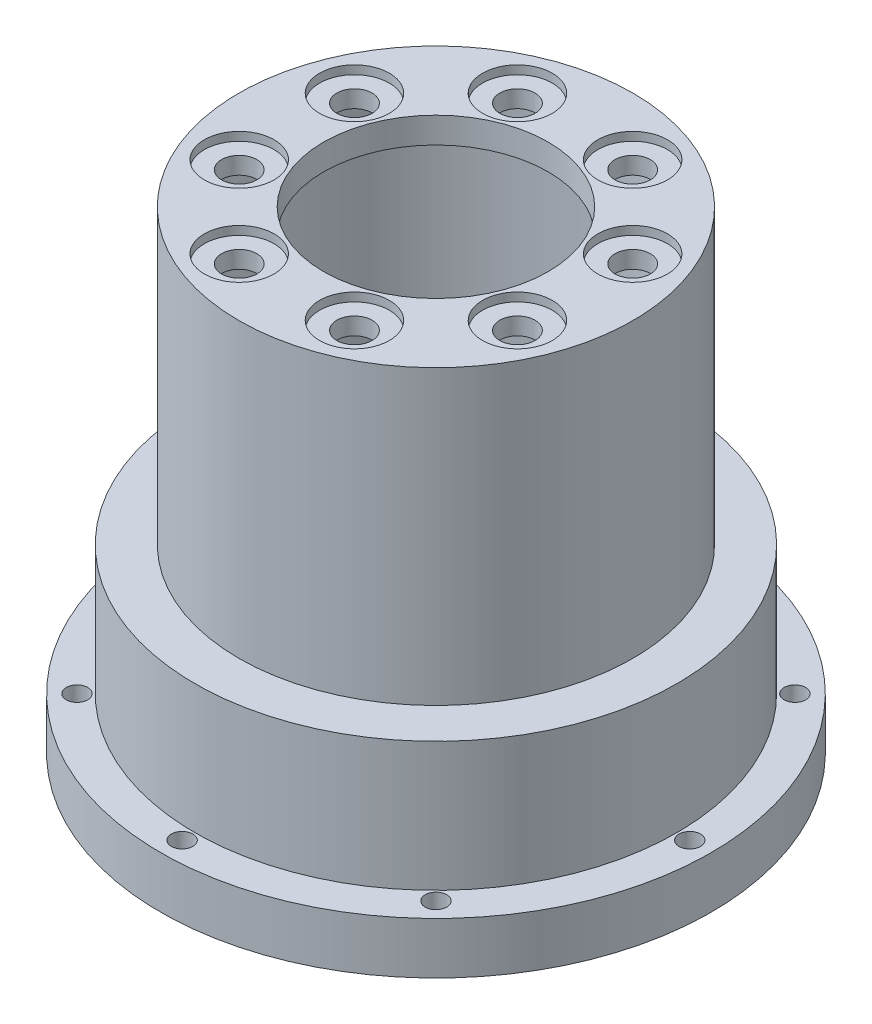
ISO-10303-21;
HEADER;
FILE_DESCRIPTION(('STEP AP214'),'2;1');
FILE_NAME('part.step','',(''),(''),'','','');
FILE_SCHEMA(('AUTOMOTIVE_DESIGN { 1 0 10303 214 1 1 1 1 }'));
ENDSEC;
DATA;
#1=APPLICATION_CONTEXT('core data for automotive mechanical design processes');
#2=APPLICATION_PROTOCOL_DEFINITION('international standard','automotive_design',2000,#1);
#3=PRODUCT_CONTEXT('',#1,'mechanical');
#4=PRODUCT('Part','Part','',(#3));
#5=PRODUCT_RELATED_PRODUCT_CATEGORY('part','',(#4));
#6=PRODUCT_DEFINITION_FORMATION('','',#4);
#7=PRODUCT_DEFINITION_CONTEXT('part definition',#1,'design');
#8=PRODUCT_DEFINITION('design','',#6,#7);
#9=PRODUCT_DEFINITION_SHAPE('','',#8);
#10=(LENGTH_UNIT() NAMED_UNIT(*) SI_UNIT(.MILLI.,.METRE.));
#11=(NAMED_UNIT(*) PLANE_ANGLE_UNIT() SI_UNIT($,.RADIAN.));
#12=(NAMED_UNIT(*) SI_UNIT($,.STERADIAN.) SOLID_ANGLE_UNIT());
#13=UNCERTAINTY_MEASURE_WITH_UNIT(LENGTH_MEASURE(1.E-05),#10,'distance_accuracy_value','');
#14=(GEOMETRIC_REPRESENTATION_CONTEXT(3) GLOBAL_UNCERTAINTY_ASSIGNED_CONTEXT((#13)) GLOBAL_UNIT_ASSIGNED_CONTEXT((#10,
#11,#12)) REPRESENTATION_CONTEXT('',''));
#15=CARTESIAN_POINT('',(0.,0.,0.));
#16=DIRECTION('',(0.,0.,1.));
#17=DIRECTION('',(1.,0.,0.));
#18=AXIS2_PLACEMENT_3D('',#15,#16,#17);
#19=CARTESIAN_POINT('',(-16.1678918189474,45.,-6.69696006638937));
#20=DIRECTION('',(0.,1.,0.));
#21=DIRECTION('',(0.,0.,1.));
#22=AXIS2_PLACEMENT_3D('',#19,#20,#21);
#23=CYLINDRICAL_SURFACE('',#22,2.05);
#24=CARTESIAN_POINT('',(-16.1678918189474,52.,-6.69696006638937));
#25=DIRECTION('',(0.,-1.,0.));
#26=DIRECTION('',(0.,0.,-1.));
#27=AXIS2_PLACEMENT_3D('',#24,#25,#26);
#28=CIRCLE('',#27,2.05);
#29=CARTESIAN_POINT('',(-16.1678918189474,52.,-8.74696006638937));
#30=VERTEX_POINT('',#29);
#31=EDGE_CURVE('E60',#30,#30,#28,.T.);
#32=ORIENTED_EDGE('',*,*,#31,.T.);
#33=EDGE_LOOP('',(#32));
#34=FACE_BOUND('',#33,.T.);
#35=CARTESIAN_POINT('',(-16.1678918189474,54.,-6.69696006638937));
#36=DIRECTION('',(0.,1.,0.));
#37=DIRECTION('',(0.,0.,1.));
#38=AXIS2_PLACEMENT_3D('',#35,#36,#37);
#39=CIRCLE('',#38,2.05);
#40=CARTESIAN_POINT('',(-16.1678918189474,54.,-4.64696006638937));
#41=VERTEX_POINT('',#40);
#42=EDGE_CURVE('E42',#41,#41,#39,.F.);
#43=ORIENTED_EDGE('',*,*,#42,.F.);
#44=EDGE_LOOP('',(#43));
#45=FACE_BOUND('',#44,.T.);
#46=ADVANCED_FACE('F38',(#34,#45),#23,.F.);
#47=CARTESIAN_POINT('',(-16.1678918189476,45.,6.6969600663888));
#48=DIRECTION('',(0.,1.,0.));
#49=DIRECTION('',(0.,0.,1.));
#50=AXIS2_PLACEMENT_3D('',#47,#48,#49);
#51=CYLINDRICAL_SURFACE('',#50,2.05);
#52=CARTESIAN_POINT('',(-16.1678918189476,52.,6.6969600663888));
#53=DIRECTION('',(0.,-1.,0.));
#54=DIRECTION('',(0.,0.,-1.));
#55=AXIS2_PLACEMENT_3D('',#52,#53,#54);
#56=CIRCLE('',#55,2.05);
#57=CARTESIAN_POINT('',(-16.1678918189476,52.,4.6469600663888));
#58=VERTEX_POINT('',#57);
#59=EDGE_CURVE('E63',#58,#58,#56,.T.);
#60=ORIENTED_EDGE('',*,*,#59,.T.);
#61=EDGE_LOOP('',(#60));
#62=FACE_BOUND('',#61,.T.);
#63=CARTESIAN_POINT('',(-16.1678918189476,54.,6.6969600663888));
#64=DIRECTION('',(0.,1.,0.));
#65=DIRECTION('',(0.,0.,1.));
#66=AXIS2_PLACEMENT_3D('',#63,#64,#65);
#67=CIRCLE('',#66,2.05);
#68=CARTESIAN_POINT('',(-16.1678918189476,54.,8.7469600663888));
#69=VERTEX_POINT('',#68);
#70=EDGE_CURVE('E99',#69,#69,#67,.F.);
#71=ORIENTED_EDGE('',*,*,#70,.F.);
#72=EDGE_LOOP('',(#71));
#73=FACE_BOUND('',#72,.T.);
#74=ADVANCED_FACE('F210',(#62,#73),#51,.F.);
#75=CARTESIAN_POINT('',(-6.69696006638931,45.,16.1678918189474));
#76=DIRECTION('',(0.,1.,0.));
#77=DIRECTION('',(0.,0.,1.));
#78=AXIS2_PLACEMENT_3D('',#75,#76,#77);
#79=CYLINDRICAL_SURFACE('',#78,2.05);
#80=CARTESIAN_POINT('',(-6.69696006638931,52.,16.1678918189474));
#81=DIRECTION('',(0.,-1.,0.));
#82=DIRECTION('',(0.,0.,-1.));
#83=AXIS2_PLACEMENT_3D('',#80,#81,#82);
#84=CIRCLE('',#83,2.05);
#85=CARTESIAN_POINT('',(-6.69696006638931,52.,14.1178918189474));
#86=VERTEX_POINT('',#85);
#87=EDGE_CURVE('E67',#86,#86,#84,.T.);
#88=ORIENTED_EDGE('',*,*,#87,.T.);
#89=EDGE_LOOP('',(#88));
#90=FACE_BOUND('',#89,.T.);
#91=CARTESIAN_POINT('',(-6.69696006638931,54.,16.1678918189474));
#92=DIRECTION('',(0.,1.,0.));
#93=DIRECTION('',(0.,0.,1.));
#94=AXIS2_PLACEMENT_3D('',#91,#92,#93);
#95=CIRCLE('',#94,2.05);
#96=CARTESIAN_POINT('',(-6.69696006638931,54.,18.2178918189474));
#97=VERTEX_POINT('',#96);
#98=EDGE_CURVE('E97',#97,#97,#95,.F.);
#99=ORIENTED_EDGE('',*,*,#98,.F.);
#100=EDGE_LOOP('',(#99));
#101=FACE_BOUND('',#100,.T.);
#102=ADVANCED_FACE('F216',(#90,#101),#79,.F.);
#103=CARTESIAN_POINT('',(6.69696006638897,45.,16.1678918189476));
#104=DIRECTION('',(0.,1.,0.));
#105=DIRECTION('',(0.,0.,1.));
#106=AXIS2_PLACEMENT_3D('',#103,#104,#105);
#107=CYLINDRICAL_SURFACE('',#106,2.05);
#108=CARTESIAN_POINT('',(6.69696006638897,52.,16.1678918189476));
#109=DIRECTION('',(0.,-1.,0.));
#110=DIRECTION('',(0.,0.,-1.));
#111=AXIS2_PLACEMENT_3D('',#108,#109,#110);
#112=CIRCLE('',#111,2.05);
#113=CARTESIAN_POINT('',(6.69696006638897,52.,14.1178918189476));
#114=VERTEX_POINT('',#113);
#115=EDGE_CURVE('E70',#114,#114,#112,.T.);
#116=ORIENTED_EDGE('',*,*,#115,.T.);
#117=EDGE_LOOP('',(#116));
#118=FACE_BOUND('',#117,.T.);
#119=CARTESIAN_POINT('',(6.69696006638897,54.,16.1678918189476));
#120=DIRECTION('',(0.,1.,0.));
#121=DIRECTION('',(0.,0.,1.));
#122=AXIS2_PLACEMENT_3D('',#119,#120,#121);
#123=CIRCLE('',#122,2.05);
#124=CARTESIAN_POINT('',(6.69696006638897,54.,18.2178918189476));
#125=VERTEX_POINT('',#124);
#126=EDGE_CURVE('E94',#125,#125,#123,.F.);
#127=ORIENTED_EDGE('',*,*,#126,.F.);
#128=EDGE_LOOP('',(#127));
#129=FACE_BOUND('',#128,.T.);
#130=ADVANCED_FACE('F531',(#118,#129),#107,.F.);
#131=CARTESIAN_POINT('',(16.1678918189474,45.,6.69696006638926));
#132=DIRECTION('',(0.,1.,0.));
#133=DIRECTION('',(0.,0.,1.));
#134=AXIS2_PLACEMENT_3D('',#131,#132,#133);
#135=CYLINDRICAL_SURFACE('',#134,2.05);
#136=CARTESIAN_POINT('',(16.1678918189474,52.,6.69696006638926));
#137=DIRECTION('',(0.,-1.,0.));
#138=DIRECTION('',(0.,0.,-1.));
#139=AXIS2_PLACEMENT_3D('',#136,#137,#138);
#140=CIRCLE('',#139,2.05);
#141=CARTESIAN_POINT('',(16.1678918189474,52.,4.64696006638926));
#142=VERTEX_POINT('',#141);
#143=EDGE_CURVE('E73',#142,#142,#140,.T.);
#144=ORIENTED_EDGE('',*,*,#143,.T.);
#145=EDGE_LOOP('',(#144));
#146=FACE_BOUND('',#145,.T.);
#147=CARTESIAN_POINT('',(16.1678918189474,54.,6.69696006638926));
#148=DIRECTION('',(0.,1.,0.));
#149=DIRECTION('',(0.,0.,1.));
#150=AXIS2_PLACEMENT_3D('',#147,#148,#149);
#151=CIRCLE('',#150,2.05);
#152=CARTESIAN_POINT('',(16.1678918189474,54.,8.74696006638926));
#153=VERTEX_POINT('',#152);
#154=EDGE_CURVE('E91',#153,#153,#151,.F.);
#155=ORIENTED_EDGE('',*,*,#154,.F.);
#156=EDGE_LOOP('',(#155));
#157=FACE_BOUND('',#156,.T.);
#158=ADVANCED_FACE('F539',(#146,#157),#135,.F.);
#159=CARTESIAN_POINT('',(16.1678918189476,45.,-6.69696006638892));
#160=DIRECTION('',(0.,1.,0.));
#161=DIRECTION('',(0.,0.,1.));
#162=AXIS2_PLACEMENT_3D('',#159,#160,#161);
#163=CYLINDRICAL_SURFACE('',#162,2.05);
#164=CARTESIAN_POINT('',(16.1678918189476,52.,-6.69696006638892));
#165=DIRECTION('',(0.,-1.,0.));
#166=DIRECTION('',(0.,0.,-1.));
#167=AXIS2_PLACEMENT_3D('',#164,#165,#166);
#168=CIRCLE('',#167,2.05);
#169=CARTESIAN_POINT('',(16.1678918189476,52.,-8.74696006638892));
#170=VERTEX_POINT('',#169);
#171=EDGE_CURVE('E76',#170,#170,#168,.T.);
#172=ORIENTED_EDGE('',*,*,#171,.T.);
#173=EDGE_LOOP('',(#172));
#174=FACE_BOUND('',#173,.T.);
#175=CARTESIAN_POINT('',(16.1678918189476,54.,-6.69696006638892));
#176=DIRECTION('',(0.,1.,0.));
#177=DIRECTION('',(0.,0.,1.));
#178=AXIS2_PLACEMENT_3D('',#175,#176,#177);
#179=CIRCLE('',#178,2.05);
#180=CARTESIAN_POINT('',(16.1678918189476,54.,-4.64696006638892));
#181=VERTEX_POINT('',#180);
#182=EDGE_CURVE('E87',#181,#181,#179,.F.);
#183=ORIENTED_EDGE('',*,*,#182,.F.);
#184=EDGE_LOOP('',(#183));
#185=FACE_BOUND('',#184,.T.);
#186=ADVANCED_FACE('F548',(#174,#185),#163,.F.);
#187=CARTESIAN_POINT('',(6.6969600663892,45.,-16.1678918189475));
#188=DIRECTION('',(0.,1.,0.));
#189=DIRECTION('',(0.,0.,1.));
#190=AXIS2_PLACEMENT_3D('',#187,#188,#189);
#191=CYLINDRICAL_SURFACE('',#190,2.05);
#192=CARTESIAN_POINT('',(6.6969600663892,52.,-16.1678918189475));
#193=DIRECTION('',(0.,-1.,0.));
#194=DIRECTION('',(0.,0.,-1.));
#195=AXIS2_PLACEMENT_3D('',#192,#193,#194);
#196=CIRCLE('',#195,2.05);
#197=CARTESIAN_POINT('',(6.6969600663892,52.,-18.2178918189475));
#198=VERTEX_POINT('',#197);
#199=EDGE_CURVE('E59',#198,#198,#196,.T.);
#200=ORIENTED_EDGE('',*,*,#199,.T.);
#201=EDGE_LOOP('',(#200));
#202=FACE_BOUND('',#201,.T.);
#203=CARTESIAN_POINT('',(6.6969600663892,54.,-16.1678918189475));
#204=DIRECTION('',(0.,1.,0.));
#205=DIRECTION('',(0.,0.,1.));
#206=AXIS2_PLACEMENT_3D('',#203,#204,#205);
#207=CIRCLE('',#206,2.05);
#208=CARTESIAN_POINT('',(6.6969600663892,54.,-14.1178918189475));
#209=VERTEX_POINT('',#208);
#210=EDGE_CURVE('E84',#209,#209,#207,.F.);
#211=ORIENTED_EDGE('',*,*,#210,.F.);
#212=EDGE_LOOP('',(#211));
#213=FACE_BOUND('',#212,.T.);
#214=ADVANCED_FACE('F225',(#202,#213),#191,.F.);
#215=CARTESIAN_POINT('',(-6.69696006638897,45.,-16.1678918189476));
#216=DIRECTION('',(0.,1.,0.));
#217=DIRECTION('',(0.,0.,1.));
#218=AXIS2_PLACEMENT_3D('',#215,#216,#217);
#219=CYLINDRICAL_SURFACE('',#218,2.05);
#220=CARTESIAN_POINT('',(-6.69696006638897,52.,-16.1678918189476));
#221=DIRECTION('',(0.,-1.,0.));
#222=DIRECTION('',(0.,0.,-1.));
#223=AXIS2_PLACEMENT_3D('',#220,#221,#222);
#224=CIRCLE('',#223,2.05);
#225=CARTESIAN_POINT('',(-6.69696006638897,52.,-18.2178918189476));
#226=VERTEX_POINT('',#225);
#227=EDGE_CURVE('E55',#226,#226,#224,.T.);
#228=ORIENTED_EDGE('',*,*,#227,.T.);
#229=EDGE_LOOP('',(#228));
#230=FACE_BOUND('',#229,.T.);
#231=CARTESIAN_POINT('',(-6.69696006638897,54.,-16.1678918189476));
#232=DIRECTION('',(0.,1.,0.));
#233=DIRECTION('',(0.,0.,1.));
#234=AXIS2_PLACEMENT_3D('',#231,#232,#233);
#235=CIRCLE('',#234,2.05);
#236=CARTESIAN_POINT('',(-6.69696006638897,54.,-14.1178918189476));
#237=VERTEX_POINT('',#236);
#238=EDGE_CURVE('E64',#237,#237,#235,.F.);
#239=ORIENTED_EDGE('',*,*,#238,.F.);
#240=EDGE_LOOP('',(#239));
#241=FACE_BOUND('',#240,.T.);
#242=ADVANCED_FACE('F222',(#230,#241),#219,.F.);
#243=CARTESIAN_POINT('',(26.,0.,0.));
#244=DIRECTION('',(0.,-1.,0.));
#245=DIRECTION('',(0.,0.,-1.));
#246=AXIS2_PLACEMENT_3D('',#243,#244,#245);
#247=PLANE('',#246);
#248=CARTESIAN_POINT('',(20.8596500450032,0.,-20.8596500450031));
#249=DIRECTION('',(0.,-1.,0.));
#250=DIRECTION('',(0.,0.,-1.));
#251=AXIS2_PLACEMENT_3D('',#248,#249,#250);
#252=CIRCLE('',#251,1.24999999999999);
#253=CARTESIAN_POINT('',(20.8596500450032,0.,-22.1096500450031));
#254=VERTEX_POINT('',#253);
#255=EDGE_CURVE('E58',#254,#254,#252,.T.);
#256=ORIENTED_EDGE('',*,*,#255,.F.);
#257=EDGE_LOOP('',(#256));
#258=FACE_BOUND('',#257,.T.);
#259=CARTESIAN_POINT('',(-20.8596500450031,0.,-20.8596500450032));
#260=DIRECTION('',(0.,-1.,0.));
#261=DIRECTION('',(0.,0.,-1.));
#262=AXIS2_PLACEMENT_3D('',#259,#260,#261);
#263=CIRCLE('',#262,1.24999999999999);
#264=CARTESIAN_POINT('',(-20.8596500450031,0.,-22.1096500450032));
#265=VERTEX_POINT('',#264);
#266=EDGE_CURVE('E120',#265,#265,#263,.T.);
#267=ORIENTED_EDGE('',*,*,#266,.F.);
#268=EDGE_LOOP('',(#267));
#269=FACE_BOUND('',#268,.T.);
#270=CARTESIAN_POINT('',(-20.8596500450032,0.,20.8596500450031));
#271=DIRECTION('',(0.,-1.,0.));
#272=DIRECTION('',(0.,0.,-1.));
#273=AXIS2_PLACEMENT_3D('',#270,#271,#272);
#274=CIRCLE('',#273,1.24999999999999);
#275=CARTESIAN_POINT('',(-20.8596500450032,0.,19.6096500450031));
#276=VERTEX_POINT('',#275);
#277=EDGE_CURVE('E126',#276,#276,#274,.T.);
#278=ORIENTED_EDGE('',*,*,#277,.F.);
#279=EDGE_LOOP('',(#278));
#280=FACE_BOUND('',#279,.T.);
#281=CARTESIAN_POINT('',(20.8596500450031,0.,20.8596500450032));
#282=DIRECTION('',(0.,-1.,0.));
#283=DIRECTION('',(0.,0.,-1.));
#284=AXIS2_PLACEMENT_3D('',#281,#282,#283);
#285=CIRCLE('',#284,1.24999999999999);
#286=CARTESIAN_POINT('',(20.8596500450031,0.,19.6096500450032));
#287=VERTEX_POINT('',#286);
#288=EDGE_CURVE('E132',#287,#287,#285,.T.);
#289=ORIENTED_EDGE('',*,*,#288,.F.);
#290=EDGE_LOOP('',(#289));
#291=FACE_BOUND('',#290,.T.);
#292=CARTESIAN_POINT('',(0.,0.,-29.5));
#293=DIRECTION('',(0.,-1.,0.));
#294=DIRECTION('',(0.,0.,-1.));
#295=AXIS2_PLACEMENT_3D('',#292,#293,#294);
#296=CIRCLE('',#295,1.24999999999999);
#297=CARTESIAN_POINT('',(0.,0.,-30.75));
#298=VERTEX_POINT('',#297);
#299=EDGE_CURVE('E138',#298,#298,#296,.T.);
#300=ORIENTED_EDGE('',*,*,#299,.F.);
#301=EDGE_LOOP('',(#300));
#302=FACE_BOUND('',#301,.T.);
#303=CARTESIAN_POINT('',(-29.5,0.,0.));
#304=DIRECTION('',(0.,-1.,0.));
#305=DIRECTION('',(0.,0.,-1.));
#306=AXIS2_PLACEMENT_3D('',#303,#304,#305);
#307=CIRCLE('',#306,1.24999999999999);
#308=CARTESIAN_POINT('',(-29.5,0.,-1.24999999999999));
#309=VERTEX_POINT('',#308);
#310=EDGE_CURVE('E144',#309,#309,#307,.T.);
#311=ORIENTED_EDGE('',*,*,#310,.F.);
#312=EDGE_LOOP('',(#311));
#313=FACE_BOUND('',#312,.T.);
#314=CARTESIAN_POINT('',(0.,0.,29.5));
#315=DIRECTION('',(0.,-1.,0.));
#316=DIRECTION('',(0.,0.,-1.));
#317=AXIS2_PLACEMENT_3D('',#314,#315,#316);
#318=CIRCLE('',#317,1.24999999999999);
#319=CARTESIAN_POINT('',(0.,0.,28.25));
#320=VERTEX_POINT('',#319);
#321=EDGE_CURVE('E150',#320,#320,#318,.T.);
#322=ORIENTED_EDGE('',*,*,#321,.F.);
#323=EDGE_LOOP('',(#322));
#324=FACE_BOUND('',#323,.T.);
#325=CARTESIAN_POINT('',(29.5,0.,0.));
#326=DIRECTION('',(0.,-1.,0.));
#327=DIRECTION('',(0.,0.,-1.));
#328=AXIS2_PLACEMENT_3D('',#325,#326,#327);
#329=CIRCLE('',#328,1.24999999999999);
#330=CARTESIAN_POINT('',(29.5,0.,-1.24999999999999));
#331=VERTEX_POINT('',#330);
#332=EDGE_CURVE('E156',#331,#331,#329,.T.);
#333=ORIENTED_EDGE('',*,*,#332,.F.);
#334=EDGE_LOOP('',(#333));
#335=FACE_BOUND('',#334,.T.);
#336=CARTESIAN_POINT('',(0.,0.,0.));
#337=DIRECTION('',(0.,-1.,0.));
#338=DIRECTION('',(0.,0.,-1.));
#339=AXIS2_PLACEMENT_3D('',#336,#337,#338);
#340=CIRCLE('',#339,32.);
#341=CARTESIAN_POINT('',(0.,0.,-32.));
#342=VERTEX_POINT('',#341);
#343=EDGE_CURVE('E10',#342,#342,#340,.T.);
#344=ORIENTED_EDGE('',*,*,#343,.T.);
#345=EDGE_LOOP('',(#344));
#346=FACE_BOUND('',#345,.T.);
#347=CARTESIAN_POINT('',(0.,0.,0.));
#348=DIRECTION('',(0.,-1.,0.));
#349=DIRECTION('',(0.,0.,-1.));
#350=AXIS2_PLACEMENT_3D('',#347,#348,#349);
#351=CIRCLE('',#350,26.);
#352=CARTESIAN_POINT('',(0.,0.,-26.));
#353=VERTEX_POINT('',#352);
#354=EDGE_CURVE('E162',#353,#353,#351,.T.);
#355=ORIENTED_EDGE('',*,*,#354,.F.);
#356=EDGE_LOOP('',(#355));
#357=FACE_BOUND('',#356,.T.);
#358=ADVANCED_FACE('F40',(#258,#269,#280,#291,#302,#313,#324,#335,#346,#357),#247,.T.);
#359=CARTESIAN_POINT('',(0.,0.,0.));
#360=DIRECTION('',(0.,-1.,0.));
#361=DIRECTION('',(0.,0.,-1.));
#362=AXIS2_PLACEMENT_3D('',#359,#360,#361);
#363=CYLINDRICAL_SURFACE('',#362,32.);
#364=CARTESIAN_POINT('',(0.,6.,0.));
#365=DIRECTION('',(0.,-1.,0.));
#366=DIRECTION('',(0.,0.,-1.));
#367=AXIS2_PLACEMENT_3D('',#364,#365,#366);
#368=CIRCLE('',#367,32.);
#369=CARTESIAN_POINT('',(0.,6.,-32.));
#370=VERTEX_POINT('',#369);
#371=EDGE_CURVE('E46',#370,#370,#368,.T.);
#372=ORIENTED_EDGE('',*,*,#371,.T.);
#373=EDGE_LOOP('',(#372));
#374=FACE_BOUND('',#373,.T.);
#375=ORIENTED_EDGE('',*,*,#343,.F.);
#376=EDGE_LOOP('',(#375));
#377=FACE_BOUND('',#376,.T.);
#378=ADVANCED_FACE('F206',(#374,#377),#363,.T.);
#379=CARTESIAN_POINT('',(32.,6.,0.));
#380=DIRECTION('',(0.,1.,0.));
#381=DIRECTION('',(0.,0.,1.));
#382=AXIS2_PLACEMENT_3D('',#379,#380,#381);
#383=PLANE('',#382);
#384=CARTESIAN_POINT('',(20.8596500450032,6.,-20.8596500450031));
#385=DIRECTION('',(0.,1.,0.));
#386=DIRECTION('',(0.,0.,1.));
#387=AXIS2_PLACEMENT_3D('',#384,#385,#386);
#388=CIRCLE('',#387,1.24999999999999);
#389=CARTESIAN_POINT('',(20.8596500450032,6.,-19.6096500450031));
#390=VERTEX_POINT('',#389);
#391=EDGE_CURVE('E117',#390,#390,#388,.T.);
#392=ORIENTED_EDGE('',*,*,#391,.F.);
#393=EDGE_LOOP('',(#392));
#394=FACE_BOUND('',#393,.T.);
#395=CARTESIAN_POINT('',(-20.8596500450031,6.,-20.8596500450032));
#396=DIRECTION('',(0.,1.,0.));
#397=DIRECTION('',(0.,0.,1.));
#398=AXIS2_PLACEMENT_3D('',#395,#396,#397);
#399=CIRCLE('',#398,1.24999999999999);
#400=CARTESIAN_POINT('',(-20.8596500450031,6.,-19.6096500450032));
#401=VERTEX_POINT('',#400);
#402=EDGE_CURVE('E123',#401,#401,#399,.T.);
#403=ORIENTED_EDGE('',*,*,#402,.F.);
#404=EDGE_LOOP('',(#403));
#405=FACE_BOUND('',#404,.T.);
#406=CARTESIAN_POINT('',(-20.8596500450032,6.,20.8596500450031));
#407=DIRECTION('',(0.,1.,0.));
#408=DIRECTION('',(0.,0.,1.));
#409=AXIS2_PLACEMENT_3D('',#406,#407,#408);
#410=CIRCLE('',#409,1.24999999999999);
#411=CARTESIAN_POINT('',(-20.8596500450032,6.,22.1096500450031));
#412=VERTEX_POINT('',#411);
#413=EDGE_CURVE('E129',#412,#412,#410,.T.);
#414=ORIENTED_EDGE('',*,*,#413,.F.);
#415=EDGE_LOOP('',(#414));
#416=FACE_BOUND('',#415,.T.);
#417=CARTESIAN_POINT('',(20.8596500450031,6.,20.8596500450032));
#418=DIRECTION('',(0.,1.,0.));
#419=DIRECTION('',(0.,0.,1.));
#420=AXIS2_PLACEMENT_3D('',#417,#418,#419);
#421=CIRCLE('',#420,1.24999999999999);
#422=CARTESIAN_POINT('',(20.8596500450031,6.,22.1096500450032));
#423=VERTEX_POINT('',#422);
#424=EDGE_CURVE('E135',#423,#423,#421,.T.);
#425=ORIENTED_EDGE('',*,*,#424,.F.);
#426=EDGE_LOOP('',(#425));
#427=FACE_BOUND('',#426,.T.);
#428=CARTESIAN_POINT('',(0.,6.,-29.5));
#429=DIRECTION('',(0.,1.,0.));
#430=DIRECTION('',(0.,0.,1.));
#431=AXIS2_PLACEMENT_3D('',#428,#429,#430);
#432=CIRCLE('',#431,1.24999999999999);
#433=CARTESIAN_POINT('',(0.,6.,-28.25));
#434=VERTEX_POINT('',#433);
#435=EDGE_CURVE('E141',#434,#434,#432,.T.);
#436=ORIENTED_EDGE('',*,*,#435,.F.);
#437=EDGE_LOOP('',(#436));
#438=FACE_BOUND('',#437,.T.);
#439=CARTESIAN_POINT('',(-29.5,6.,0.));
#440=DIRECTION('',(0.,1.,0.));
#441=DIRECTION('',(0.,0.,1.));
#442=AXIS2_PLACEMENT_3D('',#439,#440,#441);
#443=CIRCLE('',#442,1.24999999999999);
#444=CARTESIAN_POINT('',(-29.5,6.,1.24999999999999));
#445=VERTEX_POINT('',#444);
#446=EDGE_CURVE('E147',#445,#445,#443,.T.);
#447=ORIENTED_EDGE('',*,*,#446,.F.);
#448=EDGE_LOOP('',(#447));
#449=FACE_BOUND('',#448,.T.);
#450=CARTESIAN_POINT('',(0.,6.,29.5));
#451=DIRECTION('',(0.,1.,0.));
#452=DIRECTION('',(0.,0.,1.));
#453=AXIS2_PLACEMENT_3D('',#450,#451,#452);
#454=CIRCLE('',#453,1.24999999999999);
#455=CARTESIAN_POINT('',(0.,6.,30.75));
#456=VERTEX_POINT('',#455);
#457=EDGE_CURVE('E153',#456,#456,#454,.T.);
#458=ORIENTED_EDGE('',*,*,#457,.F.);
#459=EDGE_LOOP('',(#458));
#460=FACE_BOUND('',#459,.T.);
#461=CARTESIAN_POINT('',(29.5,6.,0.));
#462=DIRECTION('',(0.,1.,0.));
#463=DIRECTION('',(0.,0.,1.));
#464=AXIS2_PLACEMENT_3D('',#461,#462,#463);
#465=CIRCLE('',#464,1.24999999999999);
#466=CARTESIAN_POINT('',(29.5,6.,1.24999999999999));
#467=VERTEX_POINT('',#466);
#468=EDGE_CURVE('E159',#467,#467,#465,.T.);
#469=ORIENTED_EDGE('',*,*,#468,.F.);
#470=EDGE_LOOP('',(#469));
#471=FACE_BOUND('',#470,.T.);
#472=CARTESIAN_POINT('',(0.,6.,0.));
#473=DIRECTION('',(0.,-1.,0.));
#474=DIRECTION('',(0.,0.,-1.));
#475=AXIS2_PLACEMENT_3D('',#472,#473,#474);
#476=CIRCLE('',#475,28.);
#477=CARTESIAN_POINT('',(0.,6.,-28.));
#478=VERTEX_POINT('',#477);
#479=EDGE_CURVE('E51',#478,#478,#476,.T.);
#480=ORIENTED_EDGE('',*,*,#479,.T.);
#481=EDGE_LOOP('',(#480));
#482=FACE_BOUND('',#481,.T.);
#483=ORIENTED_EDGE('',*,*,#371,.F.);
#484=EDGE_LOOP('',(#483));
#485=FACE_BOUND('',#484,.T.);
#486=ADVANCED_FACE('F191',(#394,#405,#416,#427,#438,#449,#460,#471,#482,#485),#383,.T.);
#487=CARTESIAN_POINT('',(0.,0.,0.));
#488=DIRECTION('',(0.,-1.,0.));
#489=DIRECTION('',(0.,0.,-1.));
#490=AXIS2_PLACEMENT_3D('',#487,#488,#489);
#491=CYLINDRICAL_SURFACE('',#490,28.);
#492=CARTESIAN_POINT('',(0.,21.,0.));
#493=DIRECTION('',(0.,-1.,0.));
#494=DIRECTION('',(0.,0.,-1.));
#495=AXIS2_PLACEMENT_3D('',#492,#493,#494);
#496=CIRCLE('',#495,28.);
#497=CARTESIAN_POINT('',(0.,21.,-28.));
#498=VERTEX_POINT('',#497);
#499=EDGE_CURVE('E186',#498,#498,#496,.T.);
#500=ORIENTED_EDGE('',*,*,#499,.T.);
#501=EDGE_LOOP('',(#500));
#502=FACE_BOUND('',#501,.T.);
#503=ORIENTED_EDGE('',*,*,#479,.F.);
#504=EDGE_LOOP('',(#503));
#505=FACE_BOUND('',#504,.T.);
#506=ADVANCED_FACE('F194',(#502,#505),#491,.T.);
#507=CARTESIAN_POINT('',(28.,21.,0.));
#508=DIRECTION('',(0.,1.,0.));
#509=DIRECTION('',(0.,0.,1.));
#510=AXIS2_PLACEMENT_3D('',#507,#508,#509);
#511=PLANE('',#510);
#512=CARTESIAN_POINT('',(0.,21.,0.));
#513=DIRECTION('',(0.,-1.,0.));
#514=DIRECTION('',(0.,0.,-1.));
#515=AXIS2_PLACEMENT_3D('',#512,#513,#514);
#516=CIRCLE('',#515,22.9);
#517=CARTESIAN_POINT('',(0.,21.,-22.9));
#518=VERTEX_POINT('',#517);
#519=EDGE_CURVE('E183',#518,#518,#516,.T.);
#520=ORIENTED_EDGE('',*,*,#519,.T.);
#521=EDGE_LOOP('',(#520));
#522=FACE_BOUND('',#521,.T.);
#523=ORIENTED_EDGE('',*,*,#499,.F.);
#524=EDGE_LOOP('',(#523));
#525=FACE_BOUND('',#524,.T.);
#526=ADVANCED_FACE('F196',(#522,#525),#511,.T.);
#527=CARTESIAN_POINT('',(0.,0.,0.));
#528=DIRECTION('',(0.,-1.,0.));
#529=DIRECTION('',(0.,0.,-1.));
#530=AXIS2_PLACEMENT_3D('',#527,#528,#529);
#531=CYLINDRICAL_SURFACE('',#530,22.9);
#532=CARTESIAN_POINT('',(0.,55.,0.));
#533=DIRECTION('',(0.,-1.,0.));
#534=DIRECTION('',(0.,0.,-1.));
#535=AXIS2_PLACEMENT_3D('',#532,#533,#534);
#536=CIRCLE('',#535,22.9);
#537=CARTESIAN_POINT('',(0.,55.,-22.9));
#538=VERTEX_POINT('',#537);
#539=EDGE_CURVE('E180',#538,#538,#536,.T.);
#540=ORIENTED_EDGE('',*,*,#539,.T.);
#541=EDGE_LOOP('',(#540));
#542=FACE_BOUND('',#541,.T.);
#543=ORIENTED_EDGE('',*,*,#519,.F.);
#544=EDGE_LOOP('',(#543));
#545=FACE_BOUND('',#544,.T.);
#546=ADVANCED_FACE('F203',(#542,#545),#531,.T.);
#547=CARTESIAN_POINT('',(22.9,55.,0.));
#548=DIRECTION('',(0.,1.,0.));
#549=DIRECTION('',(0.,0.,1.));
#550=AXIS2_PLACEMENT_3D('',#547,#548,#549);
#551=PLANE('',#550);
#552=CARTESIAN_POINT('',(6.6969600663892,55.,-16.1678918189475));
#553=DIRECTION('',(0.,1.,0.));
#554=DIRECTION('',(-0.707106781186549,0.,0.707106781186546));
#555=AXIS2_PLACEMENT_3D('',#552,#553,#554);
#556=CIRCLE('',#555,4.05);
#557=CARTESIAN_POINT('',(3.83317760258368,55.,-13.304109355142));
#558=VERTEX_POINT('',#557);
#559=EDGE_CURVE('E828',#558,#558,#556,.T.);
#560=ORIENTED_EDGE('',*,*,#559,.F.);
#561=EDGE_LOOP('',(#560));
#562=FACE_BOUND('',#561,.T.);
#563=CARTESIAN_POINT('',(16.1678918189476,55.,-6.69696006638892));
#564=DIRECTION('',(0.,1.,0.));
#565=DIRECTION('',(-1.,0.,0.));
#566=AXIS2_PLACEMENT_3D('',#563,#564,#565);
#567=CIRCLE('',#566,4.05);
#568=CARTESIAN_POINT('',(12.1178918189476,55.,-6.69696006638893));
#569=VERTEX_POINT('',#568);
#570=EDGE_CURVE('E822',#569,#569,#567,.T.);
#571=ORIENTED_EDGE('',*,*,#570,.F.);
#572=EDGE_LOOP('',(#571));
#573=FACE_BOUND('',#572,.T.);
#574=CARTESIAN_POINT('',(16.1678918189474,55.,6.69696006638926));
#575=DIRECTION('',(0.,1.,0.));
#576=DIRECTION('',(-0.707106781186544,0.,-0.707106781186551));
#577=AXIS2_PLACEMENT_3D('',#574,#575,#576);
#578=CIRCLE('',#577,4.05);
#579=CARTESIAN_POINT('',(13.3041093551419,55.,3.83317760258372));
#580=VERTEX_POINT('',#579);
#581=EDGE_CURVE('E816',#580,#580,#578,.T.);
#582=ORIENTED_EDGE('',*,*,#581,.F.);
#583=EDGE_LOOP('',(#582));
#584=FACE_BOUND('',#583,.T.);
#585=CARTESIAN_POINT('',(6.69696006638897,55.,16.1678918189476));
#586=DIRECTION('',(0.,1.,0.));
#587=DIRECTION('',(0.,0.,-1.));
#588=AXIS2_PLACEMENT_3D('',#585,#586,#587);
#589=CIRCLE('',#588,4.05);
#590=CARTESIAN_POINT('',(6.69696006638897,55.,12.1178918189476));
#591=VERTEX_POINT('',#590);
#592=EDGE_CURVE('E810',#591,#591,#589,.T.);
#593=ORIENTED_EDGE('',*,*,#592,.F.);
#594=EDGE_LOOP('',(#593));
#595=FACE_BOUND('',#594,.T.);
#596=CARTESIAN_POINT('',(-6.69696006638931,55.,16.1678918189474));
#597=DIRECTION('',(0.,1.,0.));
#598=DIRECTION('',(0.707106781186554,0.,-0.707106781186541));
#599=AXIS2_PLACEMENT_3D('',#596,#597,#598);
#600=CIRCLE('',#599,4.05);
#601=CARTESIAN_POINT('',(-3.83317760258377,55.,13.3041093551419));
#602=VERTEX_POINT('',#601);
#603=EDGE_CURVE('E804',#602,#602,#600,.T.);
#604=ORIENTED_EDGE('',*,*,#603,.F.);
#605=EDGE_LOOP('',(#604));
#606=FACE_BOUND('',#605,.T.);
#607=CARTESIAN_POINT('',(-16.1678918189476,55.,6.6969600663888));
#608=DIRECTION('',(0.,1.,0.));
#609=DIRECTION('',(1.,0.,0.));
#610=AXIS2_PLACEMENT_3D('',#607,#608,#609);
#611=CIRCLE('',#610,4.05);
#612=CARTESIAN_POINT('',(-12.1178918189476,55.,6.69696006638885));
#613=VERTEX_POINT('',#612);
#614=EDGE_CURVE('E796',#613,#613,#611,.T.);
#615=ORIENTED_EDGE('',*,*,#614,.F.);
#616=EDGE_LOOP('',(#615));
#617=FACE_BOUND('',#616,.T.);
#618=CARTESIAN_POINT('',(-16.1678918189474,55.,-6.69696006638937));
#619=DIRECTION('',(0.,1.,0.));
#620=DIRECTION('',(0.707106781186539,0.,0.707106781186556));
#621=AXIS2_PLACEMENT_3D('',#618,#619,#620);
#622=CIRCLE('',#621,4.05);
#623=CARTESIAN_POINT('',(-13.3041093551419,55.,-3.83317760258382));
#624=VERTEX_POINT('',#623);
#625=EDGE_CURVE('E794',#624,#624,#622,.T.);
#626=ORIENTED_EDGE('',*,*,#625,.F.);
#627=EDGE_LOOP('',(#626));
#628=FACE_BOUND('',#627,.T.);
#629=CARTESIAN_POINT('',(-6.69696006638897,55.,-16.1678918189476));
#630=DIRECTION('',(0.,1.,0.));
#631=DIRECTION('',(0.,0.,1.));
#632=AXIS2_PLACEMENT_3D('',#629,#630,#631);
#633=CIRCLE('',#632,4.05);
#634=CARTESIAN_POINT('',(-6.69696006638897,55.,-12.1178918189476));
#635=VERTEX_POINT('',#634);
#636=EDGE_CURVE('E104',#635,#635,#633,.T.);
#637=ORIENTED_EDGE('',*,*,#636,.F.);
#638=EDGE_LOOP('',(#637));
#639=FACE_BOUND('',#638,.T.);
#640=CARTESIAN_POINT('',(0.,55.,0.));
#641=DIRECTION('',(0.,-1.,0.));
#642=DIRECTION('',(0.,0.,-1.));
#643=AXIS2_PLACEMENT_3D('',#640,#641,#642);
#644=CIRCLE('',#643,13.05);
#645=CARTESIAN_POINT('',(0.,55.,-13.05));
#646=VERTEX_POINT('',#645);
#647=EDGE_CURVE('E177',#646,#646,#644,.T.);
#648=ORIENTED_EDGE('',*,*,#647,.T.);
#649=EDGE_LOOP('',(#648));
#650=FACE_BOUND('',#649,.T.);
#651=ORIENTED_EDGE('',*,*,#539,.F.);
#652=EDGE_LOOP('',(#651));
#653=FACE_BOUND('',#652,.T.);
#654=ADVANCED_FACE('F279',(#562,#573,#584,#595,#606,#617,#628,#639,#650,#653),#551,.T.);
#655=CARTESIAN_POINT('',(0.,0.,0.));
#656=DIRECTION('',(0.,-1.,0.));
#657=DIRECTION('',(0.,0.,-1.));
#658=AXIS2_PLACEMENT_3D('',#655,#656,#657);
#659=CYLINDRICAL_SURFACE('',#658,13.05);
#660=CARTESIAN_POINT('',(0.,52.,0.));
#661=DIRECTION('',(0.,-1.,0.));
#662=DIRECTION('',(0.,0.,-1.));
#663=AXIS2_PLACEMENT_3D('',#660,#661,#662);
#664=CIRCLE('',#663,13.05);
#665=CARTESIAN_POINT('',(0.,52.,-13.05));
#666=VERTEX_POINT('',#665);
#667=EDGE_CURVE('E174',#666,#666,#664,.T.);
#668=ORIENTED_EDGE('',*,*,#667,.T.);
#669=EDGE_LOOP('',(#668));
#670=FACE_BOUND('',#669,.T.);
#671=ORIENTED_EDGE('',*,*,#647,.F.);
#672=EDGE_LOOP('',(#671));
#673=FACE_BOUND('',#672,.T.);
#674=ADVANCED_FACE('F275',(#670,#673),#659,.F.);
#675=CARTESIAN_POINT('',(13.05,52.,0.));
#676=DIRECTION('',(0.,-1.,0.));
#677=DIRECTION('',(0.,0.,-1.));
#678=AXIS2_PLACEMENT_3D('',#675,#676,#677);
#679=PLANE('',#678);
#680=ORIENTED_EDGE('',*,*,#199,.F.);
#681=EDGE_LOOP('',(#680));
#682=FACE_BOUND('',#681,.T.);
#683=ORIENTED_EDGE('',*,*,#171,.F.);
#684=EDGE_LOOP('',(#683));
#685=FACE_BOUND('',#684,.T.);
#686=ORIENTED_EDGE('',*,*,#143,.F.);
#687=EDGE_LOOP('',(#686));
#688=FACE_BOUND('',#687,.T.);
#689=ORIENTED_EDGE('',*,*,#115,.F.);
#690=EDGE_LOOP('',(#689));
#691=FACE_BOUND('',#690,.T.);
#692=ORIENTED_EDGE('',*,*,#87,.F.);
#693=EDGE_LOOP('',(#692));
#694=FACE_BOUND('',#693,.T.);
#695=ORIENTED_EDGE('',*,*,#59,.F.);
#696=EDGE_LOOP('',(#695));
#697=FACE_BOUND('',#696,.T.);
#698=ORIENTED_EDGE('',*,*,#31,.F.);
#699=EDGE_LOOP('',(#698));
#700=FACE_BOUND('',#699,.T.);
#701=ORIENTED_EDGE('',*,*,#227,.F.);
#702=EDGE_LOOP('',(#701));
#703=FACE_BOUND('',#702,.T.);
#704=CARTESIAN_POINT('',(0.,52.,0.));
#705=DIRECTION('',(0.,-1.,0.));
#706=DIRECTION('',(0.,0.,-1.));
#707=AXIS2_PLACEMENT_3D('',#704,#705,#706);
#708=CIRCLE('',#707,21.1);
#709=CARTESIAN_POINT('',(0.,52.,-21.1));
#710=VERTEX_POINT('',#709);
#711=EDGE_CURVE('E171',#710,#710,#708,.T.);
#712=ORIENTED_EDGE('',*,*,#711,.T.);
#713=EDGE_LOOP('',(#712));
#714=FACE_BOUND('',#713,.T.);
#715=ORIENTED_EDGE('',*,*,#667,.F.);
#716=EDGE_LOOP('',(#715));
#717=FACE_BOUND('',#716,.T.);
#718=ADVANCED_FACE('F271',(#682,#685,#688,#691,#694,#697,#700,#703,#714,#717),#679,.T.);
#719=CARTESIAN_POINT('',(0.,0.,0.));
#720=DIRECTION('',(0.,-1.,0.));
#721=DIRECTION('',(0.,0.,-1.));
#722=AXIS2_PLACEMENT_3D('',#719,#720,#721);
#723=CYLINDRICAL_SURFACE('',#722,21.1);
#724=CARTESIAN_POINT('',(0.,18.,0.));
#725=DIRECTION('',(0.,-1.,0.));
#726=DIRECTION('',(0.,0.,-1.));
#727=AXIS2_PLACEMENT_3D('',#724,#725,#726);
#728=CIRCLE('',#727,21.1);
#729=CARTESIAN_POINT('',(0.,18.,-21.1));
#730=VERTEX_POINT('',#729);
#731=EDGE_CURVE('E168',#730,#730,#728,.T.);
#732=ORIENTED_EDGE('',*,*,#731,.T.);
#733=EDGE_LOOP('',(#732));
#734=FACE_BOUND('',#733,.T.);
#735=ORIENTED_EDGE('',*,*,#711,.F.);
#736=EDGE_LOOP('',(#735));
#737=FACE_BOUND('',#736,.T.);
#738=ADVANCED_FACE('F267',(#734,#737),#723,.F.);
#739=CARTESIAN_POINT('',(21.1,18.,0.));
#740=DIRECTION('',(0.,-1.,0.));
#741=DIRECTION('',(0.,0.,-1.));
#742=AXIS2_PLACEMENT_3D('',#739,#740,#741);
#743=PLANE('',#742);
#744=CARTESIAN_POINT('',(0.,18.,0.));
#745=DIRECTION('',(0.,-1.,0.));
#746=DIRECTION('',(0.,0.,-1.));
#747=AXIS2_PLACEMENT_3D('',#744,#745,#746);
#748=CIRCLE('',#747,26.);
#749=CARTESIAN_POINT('',(0.,18.,-26.));
#750=VERTEX_POINT('',#749);
#751=EDGE_CURVE('E165',#750,#750,#748,.T.);
#752=ORIENTED_EDGE('',*,*,#751,.T.);
#753=EDGE_LOOP('',(#752));
#754=FACE_BOUND('',#753,.T.);
#755=ORIENTED_EDGE('',*,*,#731,.F.);
#756=EDGE_LOOP('',(#755));
#757=FACE_BOUND('',#756,.T.);
#758=ADVANCED_FACE('F263',(#754,#757),#743,.T.);
#759=CARTESIAN_POINT('',(0.,0.,0.));
#760=DIRECTION('',(0.,-1.,0.));
#761=DIRECTION('',(0.,0.,-1.));
#762=AXIS2_PLACEMENT_3D('',#759,#760,#761);
#763=CYLINDRICAL_SURFACE('',#762,26.);
#764=ORIENTED_EDGE('',*,*,#354,.T.);
#765=EDGE_LOOP('',(#764));
#766=FACE_BOUND('',#765,.T.);
#767=ORIENTED_EDGE('',*,*,#751,.F.);
#768=EDGE_LOOP('',(#767));
#769=FACE_BOUND('',#768,.T.);
#770=ADVANCED_FACE('F259',(#766,#769),#763,.F.);
#771=CARTESIAN_POINT('',(29.5,0.,0.));
#772=DIRECTION('',(0.,-1.,0.));
#773=DIRECTION('',(0.,0.,-1.));
#774=AXIS2_PLACEMENT_3D('',#771,#772,#773);
#775=CYLINDRICAL_SURFACE('',#774,1.24999999999999);
#776=ORIENTED_EDGE('',*,*,#332,.T.);
#777=EDGE_LOOP('',(#776));
#778=FACE_BOUND('',#777,.T.);
#779=ORIENTED_EDGE('',*,*,#468,.T.);
#780=EDGE_LOOP('',(#779));
#781=FACE_BOUND('',#780,.T.);
#782=ADVANCED_FACE('F255',(#778,#781),#775,.F.);
#783=CARTESIAN_POINT('',(0.,0.,29.5));
#784=DIRECTION('',(0.,-1.,0.));
#785=DIRECTION('',(0.,0.,-1.));
#786=AXIS2_PLACEMENT_3D('',#783,#784,#785);
#787=CYLINDRICAL_SURFACE('',#786,1.24999999999999);
#788=ORIENTED_EDGE('',*,*,#321,.T.);
#789=EDGE_LOOP('',(#788));
#790=FACE_BOUND('',#789,.T.);
#791=ORIENTED_EDGE('',*,*,#457,.T.);
#792=EDGE_LOOP('',(#791));
#793=FACE_BOUND('',#792,.T.);
#794=ADVANCED_FACE('F251',(#790,#793),#787,.F.);
#795=CARTESIAN_POINT('',(-29.5,0.,0.));
#796=DIRECTION('',(0.,-1.,0.));
#797=DIRECTION('',(0.,0.,-1.));
#798=AXIS2_PLACEMENT_3D('',#795,#796,#797);
#799=CYLINDRICAL_SURFACE('',#798,1.24999999999999);
#800=ORIENTED_EDGE('',*,*,#310,.T.);
#801=EDGE_LOOP('',(#800));
#802=FACE_BOUND('',#801,.T.);
#803=ORIENTED_EDGE('',*,*,#446,.T.);
#804=EDGE_LOOP('',(#803));
#805=FACE_BOUND('',#804,.T.);
#806=ADVANCED_FACE('F247',(#802,#805),#799,.F.);
#807=CARTESIAN_POINT('',(0.,0.,-29.5));
#808=DIRECTION('',(0.,-1.,0.));
#809=DIRECTION('',(0.,0.,-1.));
#810=AXIS2_PLACEMENT_3D('',#807,#808,#809);
#811=CYLINDRICAL_SURFACE('',#810,1.24999999999999);
#812=ORIENTED_EDGE('',*,*,#299,.T.);
#813=EDGE_LOOP('',(#812));
#814=FACE_BOUND('',#813,.T.);
#815=ORIENTED_EDGE('',*,*,#435,.T.);
#816=EDGE_LOOP('',(#815));
#817=FACE_BOUND('',#816,.T.);
#818=ADVANCED_FACE('F243',(#814,#817),#811,.F.);
#819=CARTESIAN_POINT('',(20.8596500450031,0.,20.8596500450032));
#820=DIRECTION('',(0.,-1.,0.));
#821=DIRECTION('',(0.,0.,-1.));
#822=AXIS2_PLACEMENT_3D('',#819,#820,#821);
#823=CYLINDRICAL_SURFACE('',#822,1.24999999999999);
#824=ORIENTED_EDGE('',*,*,#288,.T.);
#825=EDGE_LOOP('',(#824));
#826=FACE_BOUND('',#825,.T.);
#827=ORIENTED_EDGE('',*,*,#424,.T.);
#828=EDGE_LOOP('',(#827));
#829=FACE_BOUND('',#828,.T.);
#830=ADVANCED_FACE('F239',(#826,#829),#823,.F.);
#831=CARTESIAN_POINT('',(-20.8596500450032,0.,20.8596500450031));
#832=DIRECTION('',(0.,-1.,0.));
#833=DIRECTION('',(0.,0.,-1.));
#834=AXIS2_PLACEMENT_3D('',#831,#832,#833);
#835=CYLINDRICAL_SURFACE('',#834,1.24999999999999);
#836=ORIENTED_EDGE('',*,*,#277,.T.);
#837=EDGE_LOOP('',(#836));
#838=FACE_BOUND('',#837,.T.);
#839=ORIENTED_EDGE('',*,*,#413,.T.);
#840=EDGE_LOOP('',(#839));
#841=FACE_BOUND('',#840,.T.);
#842=ADVANCED_FACE('F235',(#838,#841),#835,.F.);
#843=CARTESIAN_POINT('',(-20.8596500450031,0.,-20.8596500450032));
#844=DIRECTION('',(0.,-1.,0.));
#845=DIRECTION('',(0.,0.,-1.));
#846=AXIS2_PLACEMENT_3D('',#843,#844,#845);
#847=CYLINDRICAL_SURFACE('',#846,1.24999999999999);
#848=ORIENTED_EDGE('',*,*,#266,.T.);
#849=EDGE_LOOP('',(#848));
#850=FACE_BOUND('',#849,.T.);
#851=ORIENTED_EDGE('',*,*,#402,.T.);
#852=EDGE_LOOP('',(#851));
#853=FACE_BOUND('',#852,.T.);
#854=ADVANCED_FACE('F231',(#850,#853),#847,.F.);
#855=CARTESIAN_POINT('',(20.8596500450032,0.,-20.8596500450031));
#856=DIRECTION('',(0.,-1.,0.));
#857=DIRECTION('',(0.,0.,-1.));
#858=AXIS2_PLACEMENT_3D('',#855,#856,#857);
#859=CYLINDRICAL_SURFACE('',#858,1.24999999999999);
#860=ORIENTED_EDGE('',*,*,#255,.T.);
#861=EDGE_LOOP('',(#860));
#862=FACE_BOUND('',#861,.T.);
#863=ORIENTED_EDGE('',*,*,#391,.T.);
#864=EDGE_LOOP('',(#863));
#865=FACE_BOUND('',#864,.T.);
#866=ADVANCED_FACE('F227',(#862,#865),#859,.F.);
#867=CARTESIAN_POINT('',(-6.69696006638897,54.,-16.1678918189476));
#868=DIRECTION('',(0.,1.,0.));
#869=DIRECTION('',(0.,0.,1.));
#870=AXIS2_PLACEMENT_3D('',#867,#868,#869);
#871=PLANE('',#870);
#872=CARTESIAN_POINT('',(-6.69696006638897,54.,-16.1678918189476));
#873=DIRECTION('',(0.,1.,0.));
#874=DIRECTION('',(0.,0.,1.));
#875=AXIS2_PLACEMENT_3D('',#872,#873,#874);
#876=CIRCLE('',#875,4.05);
#877=CARTESIAN_POINT('',(-6.69696006638897,54.,-12.1178918189476));
#878=VERTEX_POINT('',#877);
#879=EDGE_CURVE('E83',#878,#878,#876,.T.);
#880=ORIENTED_EDGE('',*,*,#879,.T.);
#881=EDGE_LOOP('',(#880));
#882=FACE_BOUND('',#881,.T.);
#883=ORIENTED_EDGE('',*,*,#238,.T.);
#884=EDGE_LOOP('',(#883));
#885=FACE_BOUND('',#884,.T.);
#886=ADVANCED_FACE('F230',(#882,#885),#871,.T.);
#887=CARTESIAN_POINT('',(-6.69696006638897,54.,-16.1678918189476));
#888=DIRECTION('',(0.,1.,0.));
#889=DIRECTION('',(0.,0.,1.));
#890=AXIS2_PLACEMENT_3D('',#887,#888,#889);
#891=CYLINDRICAL_SURFACE('',#890,4.05);
#892=ORIENTED_EDGE('',*,*,#879,.F.);
#893=EDGE_LOOP('',(#892));
#894=FACE_BOUND('',#893,.T.);
#895=ORIENTED_EDGE('',*,*,#636,.T.);
#896=EDGE_LOOP('',(#895));
#897=FACE_BOUND('',#896,.T.);
#898=ADVANCED_FACE('F366',(#894,#897),#891,.F.);
#899=CARTESIAN_POINT('',(6.6969600663892,54.,-16.1678918189475));
#900=DIRECTION('',(0.,1.,0.));
#901=DIRECTION('',(-0.707106781186549,0.,0.707106781186546));
#902=AXIS2_PLACEMENT_3D('',#899,#900,#901);
#903=PLANE('',#902);
#904=CARTESIAN_POINT('',(6.6969600663892,54.,-16.1678918189475));
#905=DIRECTION('',(0.,1.,0.));
#906=DIRECTION('',(-0.707106781186549,0.,0.707106781186546));
#907=AXIS2_PLACEMENT_3D('',#904,#905,#906);
#908=CIRCLE('',#907,4.05);
#909=CARTESIAN_POINT('',(3.83317760258368,54.,-13.304109355142));
#910=VERTEX_POINT('',#909);
#911=EDGE_CURVE('E88',#910,#910,#908,.T.);
#912=ORIENTED_EDGE('',*,*,#911,.T.);
#913=EDGE_LOOP('',(#912));
#914=FACE_BOUND('',#913,.T.);
#915=ORIENTED_EDGE('',*,*,#210,.T.);
#916=EDGE_LOOP('',(#915));
#917=FACE_BOUND('',#916,.T.);
#918=ADVANCED_FACE('F374',(#914,#917),#903,.T.);
#919=CARTESIAN_POINT('',(6.6969600663892,54.,-16.1678918189475));
#920=DIRECTION('',(0.,1.,0.));
#921=DIRECTION('',(0.,0.,1.));
#922=AXIS2_PLACEMENT_3D('',#919,#920,#921);
#923=CYLINDRICAL_SURFACE('',#922,4.05);
#924=ORIENTED_EDGE('',*,*,#911,.F.);
#925=EDGE_LOOP('',(#924));
#926=FACE_BOUND('',#925,.T.);
#927=ORIENTED_EDGE('',*,*,#559,.T.);
#928=EDGE_LOOP('',(#927));
#929=FACE_BOUND('',#928,.T.);
#930=ADVANCED_FACE('F381',(#926,#929),#923,.F.);
#931=CARTESIAN_POINT('',(16.1678918189476,54.,-6.69696006638892));
#932=DIRECTION('',(0.,1.,0.));
#933=DIRECTION('',(-1.,0.,0.));
#934=AXIS2_PLACEMENT_3D('',#931,#932,#933);
#935=PLANE('',#934);
#936=CARTESIAN_POINT('',(16.1678918189476,54.,-6.69696006638892));
#937=DIRECTION('',(0.,1.,0.));
#938=DIRECTION('',(-1.,0.,0.));
#939=AXIS2_PLACEMENT_3D('',#936,#937,#938);
#940=CIRCLE('',#939,4.05);
#941=CARTESIAN_POINT('',(12.1178918189476,54.,-6.69696006638893));
#942=VERTEX_POINT('',#941);
#943=EDGE_CURVE('E825',#942,#942,#940,.T.);
#944=ORIENTED_EDGE('',*,*,#943,.T.);
#945=EDGE_LOOP('',(#944));
#946=FACE_BOUND('',#945,.T.);
#947=ORIENTED_EDGE('',*,*,#182,.T.);
#948=EDGE_LOOP('',(#947));
#949=FACE_BOUND('',#948,.T.);
#950=ADVANCED_FACE('F389',(#946,#949),#935,.T.);
#951=CARTESIAN_POINT('',(16.1678918189476,54.,-6.69696006638892));
#952=DIRECTION('',(0.,1.,0.));
#953=DIRECTION('',(0.,0.,1.));
#954=AXIS2_PLACEMENT_3D('',#951,#952,#953);
#955=CYLINDRICAL_SURFACE('',#954,4.05);
#956=ORIENTED_EDGE('',*,*,#943,.F.);
#957=EDGE_LOOP('',(#956));
#958=FACE_BOUND('',#957,.T.);
#959=ORIENTED_EDGE('',*,*,#570,.T.);
#960=EDGE_LOOP('',(#959));
#961=FACE_BOUND('',#960,.T.);
#962=ADVANCED_FACE('F397',(#958,#961),#955,.F.);
#963=CARTESIAN_POINT('',(16.1678918189474,54.,6.69696006638926));
#964=DIRECTION('',(0.,1.,0.));
#965=DIRECTION('',(-0.707106781186544,0.,-0.707106781186551));
#966=AXIS2_PLACEMENT_3D('',#963,#964,#965);
#967=PLANE('',#966);
#968=CARTESIAN_POINT('',(16.1678918189474,54.,6.69696006638926));
#969=DIRECTION('',(0.,1.,0.));
#970=DIRECTION('',(-0.707106781186544,0.,-0.707106781186551));
#971=AXIS2_PLACEMENT_3D('',#968,#969,#970);
#972=CIRCLE('',#971,4.05);
#973=CARTESIAN_POINT('',(13.3041093551419,54.,3.83317760258372));
#974=VERTEX_POINT('',#973);
#975=EDGE_CURVE('E819',#974,#974,#972,.T.);
#976=ORIENTED_EDGE('',*,*,#975,.T.);
#977=EDGE_LOOP('',(#976));
#978=FACE_BOUND('',#977,.T.);
#979=ORIENTED_EDGE('',*,*,#154,.T.);
#980=EDGE_LOOP('',(#979));
#981=FACE_BOUND('',#980,.T.);
#982=ADVANCED_FACE('F405',(#978,#981),#967,.T.);
#983=CARTESIAN_POINT('',(16.1678918189474,54.,6.69696006638926));
#984=DIRECTION('',(0.,1.,0.));
#985=DIRECTION('',(0.,0.,1.));
#986=AXIS2_PLACEMENT_3D('',#983,#984,#985);
#987=CYLINDRICAL_SURFACE('',#986,4.05);
#988=ORIENTED_EDGE('',*,*,#975,.F.);
#989=EDGE_LOOP('',(#988));
#990=FACE_BOUND('',#989,.T.);
#991=ORIENTED_EDGE('',*,*,#581,.T.);
#992=EDGE_LOOP('',(#991));
#993=FACE_BOUND('',#992,.T.);
#994=ADVANCED_FACE('F413',(#990,#993),#987,.F.);
#995=CARTESIAN_POINT('',(6.69696006638897,54.,16.1678918189476));
#996=DIRECTION('',(0.,1.,0.));
#997=DIRECTION('',(0.,0.,-1.));
#998=AXIS2_PLACEMENT_3D('',#995,#996,#997);
#999=PLANE('',#998);
#1000=CARTESIAN_POINT('',(6.69696006638897,54.,16.1678918189476));
#1001=DIRECTION('',(0.,1.,0.));
#1002=DIRECTION('',(0.,0.,-1.));
#1003=AXIS2_PLACEMENT_3D('',#1000,#1001,#1002);
#1004=CIRCLE('',#1003,4.05);
#1005=CARTESIAN_POINT('',(6.69696006638897,54.,12.1178918189476));
#1006=VERTEX_POINT('',#1005);
#1007=EDGE_CURVE('E813',#1006,#1006,#1004,.T.);
#1008=ORIENTED_EDGE('',*,*,#1007,.T.);
#1009=EDGE_LOOP('',(#1008));
#1010=FACE_BOUND('',#1009,.T.);
#1011=ORIENTED_EDGE('',*,*,#126,.T.);
#1012=EDGE_LOOP('',(#1011));
#1013=FACE_BOUND('',#1012,.T.);
#1014=ADVANCED_FACE('F421',(#1010,#1013),#999,.T.);
#1015=CARTESIAN_POINT('',(6.69696006638897,54.,16.1678918189476));
#1016=DIRECTION('',(0.,1.,0.));
#1017=DIRECTION('',(0.,0.,1.));
#1018=AXIS2_PLACEMENT_3D('',#1015,#1016,#1017);
#1019=CYLINDRICAL_SURFACE('',#1018,4.05);
#1020=ORIENTED_EDGE('',*,*,#1007,.F.);
#1021=EDGE_LOOP('',(#1020));
#1022=FACE_BOUND('',#1021,.T.);
#1023=ORIENTED_EDGE('',*,*,#592,.T.);
#1024=EDGE_LOOP('',(#1023));
#1025=FACE_BOUND('',#1024,.T.);
#1026=ADVANCED_FACE('F429',(#1022,#1025),#1019,.F.);
#1027=CARTESIAN_POINT('',(-6.69696006638931,54.,16.1678918189474));
#1028=DIRECTION('',(0.,1.,0.));
#1029=DIRECTION('',(0.707106781186554,0.,-0.707106781186541));
#1030=AXIS2_PLACEMENT_3D('',#1027,#1028,#1029);
#1031=PLANE('',#1030);
#1032=CARTESIAN_POINT('',(-6.69696006638931,54.,16.1678918189474));
#1033=DIRECTION('',(0.,1.,0.));
#1034=DIRECTION('',(0.707106781186554,0.,-0.707106781186541));
#1035=AXIS2_PLACEMENT_3D('',#1032,#1033,#1034);
#1036=CIRCLE('',#1035,4.05);
#1037=CARTESIAN_POINT('',(-3.83317760258377,54.,13.3041093551419));
#1038=VERTEX_POINT('',#1037);
#1039=EDGE_CURVE('E807',#1038,#1038,#1036,.T.);
#1040=ORIENTED_EDGE('',*,*,#1039,.T.);
#1041=EDGE_LOOP('',(#1040));
#1042=FACE_BOUND('',#1041,.T.);
#1043=ORIENTED_EDGE('',*,*,#98,.T.);
#1044=EDGE_LOOP('',(#1043));
#1045=FACE_BOUND('',#1044,.T.);
#1046=ADVANCED_FACE('F437',(#1042,#1045),#1031,.T.);
#1047=CARTESIAN_POINT('',(-6.69696006638931,54.,16.1678918189474));
#1048=DIRECTION('',(0.,1.,0.));
#1049=DIRECTION('',(0.,0.,1.));
#1050=AXIS2_PLACEMENT_3D('',#1047,#1048,#1049);
#1051=CYLINDRICAL_SURFACE('',#1050,4.05);
#1052=ORIENTED_EDGE('',*,*,#1039,.F.);
#1053=EDGE_LOOP('',(#1052));
#1054=FACE_BOUND('',#1053,.T.);
#1055=ORIENTED_EDGE('',*,*,#603,.T.);
#1056=EDGE_LOOP('',(#1055));
#1057=FACE_BOUND('',#1056,.T.);
#1058=ADVANCED_FACE('F445',(#1054,#1057),#1051,.F.);
#1059=CARTESIAN_POINT('',(-16.1678918189476,54.,6.6969600663888));
#1060=DIRECTION('',(0.,1.,0.));
#1061=DIRECTION('',(1.,0.,0.));
#1062=AXIS2_PLACEMENT_3D('',#1059,#1060,#1061);
#1063=PLANE('',#1062);
#1064=CARTESIAN_POINT('',(-16.1678918189476,54.,6.6969600663888));
#1065=DIRECTION('',(0.,1.,0.));
#1066=DIRECTION('',(1.,0.,0.));
#1067=AXIS2_PLACEMENT_3D('',#1064,#1065,#1066);
#1068=CIRCLE('',#1067,4.05);
#1069=CARTESIAN_POINT('',(-12.1178918189476,54.,6.69696006638885));
#1070=VERTEX_POINT('',#1069);
#1071=EDGE_CURVE('E801',#1070,#1070,#1068,.T.);
#1072=ORIENTED_EDGE('',*,*,#1071,.T.);
#1073=EDGE_LOOP('',(#1072));
#1074=FACE_BOUND('',#1073,.T.);
#1075=ORIENTED_EDGE('',*,*,#70,.T.);
#1076=EDGE_LOOP('',(#1075));
#1077=FACE_BOUND('',#1076,.T.);
#1078=ADVANCED_FACE('F453',(#1074,#1077),#1063,.T.);
#1079=CARTESIAN_POINT('',(-16.1678918189476,54.,6.6969600663888));
#1080=DIRECTION('',(0.,1.,0.));
#1081=DIRECTION('',(0.,0.,1.));
#1082=AXIS2_PLACEMENT_3D('',#1079,#1080,#1081);
#1083=CYLINDRICAL_SURFACE('',#1082,4.05);
#1084=ORIENTED_EDGE('',*,*,#1071,.F.);
#1085=EDGE_LOOP('',(#1084));
#1086=FACE_BOUND('',#1085,.T.);
#1087=ORIENTED_EDGE('',*,*,#614,.T.);
#1088=EDGE_LOOP('',(#1087));
#1089=FACE_BOUND('',#1088,.T.);
#1090=ADVANCED_FACE('F461',(#1086,#1089),#1083,.F.);
#1091=CARTESIAN_POINT('',(-16.1678918189474,54.,-6.69696006638937));
#1092=DIRECTION('',(0.,1.,0.));
#1093=DIRECTION('',(0.707106781186539,0.,0.707106781186556));
#1094=AXIS2_PLACEMENT_3D('',#1091,#1092,#1093);
#1095=PLANE('',#1094);
#1096=CARTESIAN_POINT('',(-16.1678918189474,54.,-6.69696006638937));
#1097=DIRECTION('',(0.,1.,0.));
#1098=DIRECTION('',(0.707106781186539,0.,0.707106781186556));
#1099=AXIS2_PLACEMENT_3D('',#1096,#1097,#1098);
#1100=CIRCLE('',#1099,4.05);
#1101=CARTESIAN_POINT('',(-13.3041093551419,54.,-3.83317760258382));
#1102=VERTEX_POINT('',#1101);
#1103=EDGE_CURVE('E791',#1102,#1102,#1100,.T.);
#1104=ORIENTED_EDGE('',*,*,#1103,.T.);
#1105=EDGE_LOOP('',(#1104));
#1106=FACE_BOUND('',#1105,.T.);
#1107=ORIENTED_EDGE('',*,*,#42,.T.);
#1108=EDGE_LOOP('',(#1107));
#1109=FACE_BOUND('',#1108,.T.);
#1110=ADVANCED_FACE('F469',(#1106,#1109),#1095,.T.);
#1111=CARTESIAN_POINT('',(-16.1678918189474,54.,-6.69696006638937));
#1112=DIRECTION('',(0.,1.,0.));
#1113=DIRECTION('',(0.,0.,1.));
#1114=AXIS2_PLACEMENT_3D('',#1111,#1112,#1113);
#1115=CYLINDRICAL_SURFACE('',#1114,4.05);
#1116=ORIENTED_EDGE('',*,*,#1103,.F.);
#1117=EDGE_LOOP('',(#1116));
#1118=FACE_BOUND('',#1117,.T.);
#1119=ORIENTED_EDGE('',*,*,#625,.T.);
#1120=EDGE_LOOP('',(#1119));
#1121=FACE_BOUND('',#1120,.T.);
#1122=ADVANCED_FACE('F477',(#1118,#1121),#1115,.F.);
#1123=CLOSED_SHELL('',(#46,#74,#102,#130,#158,#186,#214,#242,#358,#378,#486,#506,#526,#546,#654,
#674,#718,#738,#758,#770,#782,#794,#806,#818,#830,#842,#854,#866,#886,#898,#918,#930,#950,#962,
#982,#994,#1014,#1026,#1046,#1058,#1078,#1090,#1110,#1122));
#1124=MANIFOLD_SOLID_BREP('B2',#1123);
#1125=ADVANCED_BREP_SHAPE_REPRESENTATION('',(#18,#1124),#14);
#1126=SHAPE_DEFINITION_REPRESENTATION(#9,#1125);
ENDSEC;
END-ISO-10303-21;
